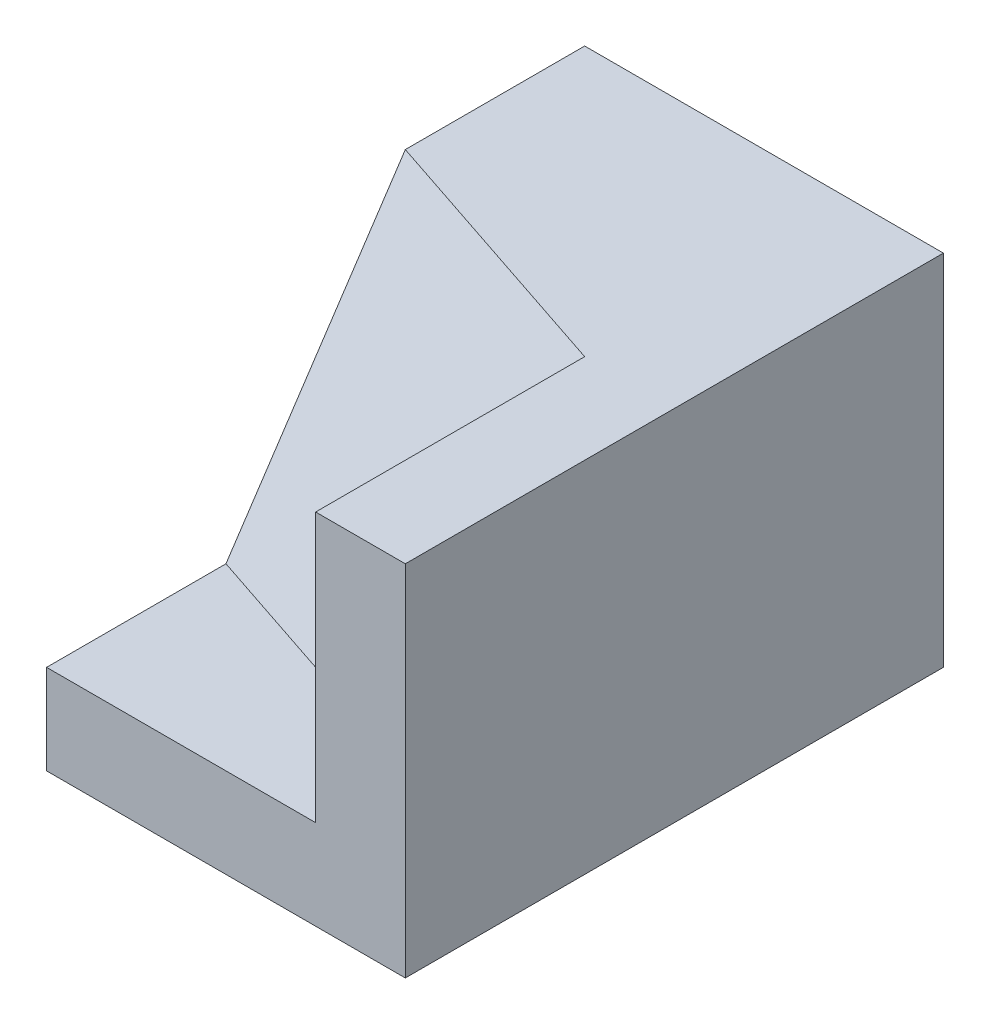
ISO-10303-21;
HEADER;
FILE_DESCRIPTION(('STEP AP214'),'2;1');
FILE_NAME('part.step','',(''),(''),'','','');
FILE_SCHEMA(('AUTOMOTIVE_DESIGN { 1 0 10303 214 1 1 1 1 }'));
ENDSEC;
DATA;
#1=APPLICATION_CONTEXT('core data for automotive mechanical design processes');
#2=APPLICATION_PROTOCOL_DEFINITION('international standard','automotive_design',2000,#1);
#3=PRODUCT_CONTEXT('',#1,'mechanical');
#4=PRODUCT('Part','Part','',(#3));
#5=PRODUCT_RELATED_PRODUCT_CATEGORY('part','',(#4));
#6=PRODUCT_DEFINITION_FORMATION('','',#4);
#7=PRODUCT_DEFINITION_CONTEXT('part definition',#1,'design');
#8=PRODUCT_DEFINITION('design','',#6,#7);
#9=PRODUCT_DEFINITION_SHAPE('','',#8);
#10=(LENGTH_UNIT() NAMED_UNIT(*) SI_UNIT(.MILLI.,.METRE.));
#11=(NAMED_UNIT(*) PLANE_ANGLE_UNIT() SI_UNIT($,.RADIAN.));
#12=(NAMED_UNIT(*) SI_UNIT($,.STERADIAN.) SOLID_ANGLE_UNIT());
#13=UNCERTAINTY_MEASURE_WITH_UNIT(LENGTH_MEASURE(1.E-05),#10,'distance_accuracy_value','');
#14=(GEOMETRIC_REPRESENTATION_CONTEXT(3) GLOBAL_UNCERTAINTY_ASSIGNED_CONTEXT((#13)) GLOBAL_UNIT_ASSIGNED_CONTEXT((#10,
#11,#12)) REPRESENTATION_CONTEXT('',''));
#15=CARTESIAN_POINT('',(0.,0.,0.));
#16=DIRECTION('',(0.,0.,1.));
#17=DIRECTION('',(1.,0.,0.));
#18=AXIS2_PLACEMENT_3D('',#15,#16,#17);
#19=CARTESIAN_POINT('',(40.,35.6438356164384,32.8767123287671));
#20=DIRECTION('',(0.,-1.,0.));
#21=DIRECTION('',(0.,0.,-1.));
#22=AXIS2_PLACEMENT_3D('',#19,#20,#21);
#23=PLANE('',#22);
#24=DIRECTION('',(-0.948683298050514,0.,-0.316227766016837));
#25=VECTOR('',#24,1.);
#26=CARTESIAN_POINT('',(31.0058479643561,35.6438356164384,3.21199498355246));
#27=LINE('',#26,#25);
#28=CARTESIAN_POINT('',(30.,35.6438356164384,2.8767123287671));
#29=VERTEX_POINT('',#28);
#30=CARTESIAN_POINT('',(0.,35.6438356164384,-7.12328767123287));
#31=VERTEX_POINT('',#30);
#32=EDGE_CURVE('E48',#29,#31,#27,.T.);
#33=ORIENTED_EDGE('',*,*,#32,.F.);
#34=DIRECTION('',(0.,0.,-1.));
#35=VECTOR('',#34,1.);
#36=CARTESIAN_POINT('',(30.,35.6438356164384,22.8767123287671));
#37=LINE('',#36,#35);
#38=CARTESIAN_POINT('',(30.,35.6438356164384,32.8767123287671));
#39=VERTEX_POINT('',#38);
#40=EDGE_CURVE('E116',#39,#29,#37,.T.);
#41=ORIENTED_EDGE('',*,*,#40,.F.);
#42=DIRECTION('',(-1.,0.,0.));
#43=VECTOR('',#42,1.);
#44=CARTESIAN_POINT('',(40.,35.6438356164384,32.8767123287671));
#45=LINE('',#44,#43);
#46=CARTESIAN_POINT('',(40.,35.6438356164384,32.8767123287671));
#47=VERTEX_POINT('',#46);
#48=EDGE_CURVE('E137',#47,#39,#45,.T.);
#49=ORIENTED_EDGE('',*,*,#48,.F.);
#50=DIRECTION('',(0.,0.,1.));
#51=VECTOR('',#50,1.);
#52=CARTESIAN_POINT('',(40.,35.6438356164384,32.8767123287671));
#53=LINE('',#52,#51);
#54=CARTESIAN_POINT('',(40.,35.6438356164384,-27.1232876712329));
#55=VERTEX_POINT('',#54);
#56=EDGE_CURVE('E57',#55,#47,#53,.T.);
#57=ORIENTED_EDGE('',*,*,#56,.F.);
#58=DIRECTION('',(-1.,0.,0.));
#59=VECTOR('',#58,1.);
#60=CARTESIAN_POINT('',(40.,35.6438356164384,-27.1232876712329));
#61=LINE('',#60,#59);
#62=CARTESIAN_POINT('',(0.,35.6438356164384,-27.1232876712329));
#63=VERTEX_POINT('',#62);
#64=EDGE_CURVE('E146',#55,#63,#61,.T.);
#65=ORIENTED_EDGE('',*,*,#64,.T.);
#66=DIRECTION('',(0.,0.,1.));
#67=VECTOR('',#66,1.);
#68=CARTESIAN_POINT('',(0.,35.6438356164384,32.8767123287671));
#69=LINE('',#68,#67);
#70=EDGE_CURVE('E132',#63,#31,#69,.T.);
#71=ORIENTED_EDGE('',*,*,#70,.T.);
#72=EDGE_LOOP('',(#33,#41,#49,#57,#65,#71));
#73=FACE_BOUND('',#72,.T.);
#74=ADVANCED_FACE('F33',(#73),#23,.F.);
#75=CARTESIAN_POINT('',(0.,0.,0.));
#76=DIRECTION('',(-1.,0.,0.));
#77=DIRECTION('',(0.,0.,1.));
#78=AXIS2_PLACEMENT_3D('',#75,#76,#77);
#79=PLANE('',#78);
#80=DIRECTION('',(0.,0.,1.));
#81=VECTOR('',#80,1.);
#82=CARTESIAN_POINT('',(0.,5.64383561643836,12.8767123287671));
#83=LINE('',#82,#81);
#84=CARTESIAN_POINT('',(0.,5.64383561643836,12.8767123287671));
#85=VERTEX_POINT('',#84);
#86=CARTESIAN_POINT('',(0.,5.64383561643836,32.8767123287671));
#87=VERTEX_POINT('',#86);
#88=EDGE_CURVE('E123',#85,#87,#83,.T.);
#89=ORIENTED_EDGE('',*,*,#88,.F.);
#90=DIRECTION('',(0.,0.832050294337844,-0.554700196225229));
#91=VECTOR('',#90,1.);
#92=CARTESIAN_POINT('',(0.,0.873705160383596,16.0567992994703));
#93=LINE('',#92,#91);
#94=EDGE_CURVE('E105',#85,#31,#93,.T.);
#95=ORIENTED_EDGE('',*,*,#94,.T.);
#96=ORIENTED_EDGE('',*,*,#70,.F.);
#97=DIRECTION('',(0.,1.,0.));
#98=VECTOR('',#97,1.);
#99=CARTESIAN_POINT('',(0.,-4.35616438356165,-27.1232876712329));
#100=LINE('',#99,#98);
#101=CARTESIAN_POINT('',(0.,-4.35616438356165,-27.1232876712329));
#102=VERTEX_POINT('',#101);
#103=EDGE_CURVE('E76',#102,#63,#100,.T.);
#104=ORIENTED_EDGE('',*,*,#103,.F.);
#105=DIRECTION('',(0.,0.,-1.));
#106=VECTOR('',#105,1.);
#107=CARTESIAN_POINT('',(0.,-4.35616438356165,32.8767123287671));
#108=LINE('',#107,#106);
#109=CARTESIAN_POINT('',(0.,-4.35616438356165,32.8767123287671));
#110=VERTEX_POINT('',#109);
#111=EDGE_CURVE('E139',#110,#102,#108,.T.);
#112=ORIENTED_EDGE('',*,*,#111,.F.);
#113=DIRECTION('',(0.,-1.,0.));
#114=VECTOR('',#113,1.);
#115=CARTESIAN_POINT('',(0.,-4.35616438356165,32.8767123287671));
#116=LINE('',#115,#114);
#117=EDGE_CURVE('E129',#87,#110,#116,.T.);
#118=ORIENTED_EDGE('',*,*,#117,.F.);
#119=EDGE_LOOP('',(#89,#95,#96,#104,#112,#118));
#120=FACE_BOUND('',#119,.T.);
#121=ADVANCED_FACE('F152',(#120),#79,.T.);
#122=CARTESIAN_POINT('',(40.,-4.35616438356165,32.8767123287671));
#123=DIRECTION('',(0.,0.,-1.));
#124=DIRECTION('',(-1.,0.,0.));
#125=AXIS2_PLACEMENT_3D('',#122,#123,#124);
#126=PLANE('',#125);
#127=ORIENTED_EDGE('',*,*,#48,.T.);
#128=DIRECTION('',(0.,1.,0.));
#129=VECTOR('',#128,1.);
#130=CARTESIAN_POINT('',(30.,5.64383561643836,32.8767123287671));
#131=LINE('',#130,#129);
#132=CARTESIAN_POINT('',(30.,5.64383561643836,32.8767123287671));
#133=VERTEX_POINT('',#132);
#134=EDGE_CURVE('E109',#133,#39,#131,.T.);
#135=ORIENTED_EDGE('',*,*,#134,.F.);
#136=DIRECTION('',(1.,0.,0.));
#137=VECTOR('',#136,1.);
#138=CARTESIAN_POINT('',(0.,5.64383561643836,32.8767123287671));
#139=LINE('',#138,#137);
#140=EDGE_CURVE('E120',#87,#133,#139,.T.);
#141=ORIENTED_EDGE('',*,*,#140,.F.);
#142=ORIENTED_EDGE('',*,*,#117,.T.);
#143=DIRECTION('',(-1.,0.,0.));
#144=VECTOR('',#143,1.);
#145=CARTESIAN_POINT('',(40.,-4.35616438356165,32.8767123287671));
#146=LINE('',#145,#144);
#147=CARTESIAN_POINT('',(40.,-4.35616438356165,32.8767123287671));
#148=VERTEX_POINT('',#147);
#149=EDGE_CURVE('E11',#148,#110,#146,.T.);
#150=ORIENTED_EDGE('',*,*,#149,.F.);
#151=DIRECTION('',(0.,-1.,0.));
#152=VECTOR('',#151,1.);
#153=CARTESIAN_POINT('',(40.,-4.35616438356165,32.8767123287671));
#154=LINE('',#153,#152);
#155=EDGE_CURVE('E130',#47,#148,#154,.T.);
#156=ORIENTED_EDGE('',*,*,#155,.F.);
#157=EDGE_LOOP('',(#127,#135,#141,#142,#150,#156));
#158=FACE_BOUND('',#157,.T.);
#159=ADVANCED_FACE('F35',(#158),#126,.F.);
#160=CARTESIAN_POINT('',(40.,-4.35616438356165,32.8767123287671));
#161=DIRECTION('',(0.,1.,0.));
#162=DIRECTION('',(0.,0.,1.));
#163=AXIS2_PLACEMENT_3D('',#160,#161,#162);
#164=PLANE('',#163);
#165=ORIENTED_EDGE('',*,*,#111,.T.);
#166=DIRECTION('',(-1.,0.,0.));
#167=VECTOR('',#166,1.);
#168=CARTESIAN_POINT('',(40.,-4.35616438356165,-27.1232876712329));
#169=LINE('',#168,#167);
#170=CARTESIAN_POINT('',(40.,-4.35616438356165,-27.1232876712329));
#171=VERTEX_POINT('',#170);
#172=EDGE_CURVE('E41',#171,#102,#169,.T.);
#173=ORIENTED_EDGE('',*,*,#172,.F.);
#174=DIRECTION('',(0.,0.,-1.));
#175=VECTOR('',#174,1.);
#176=CARTESIAN_POINT('',(40.,-4.35616438356165,32.8767123287671));
#177=LINE('',#176,#175);
#178=EDGE_CURVE('E83',#148,#171,#177,.T.);
#179=ORIENTED_EDGE('',*,*,#178,.F.);
#180=ORIENTED_EDGE('',*,*,#149,.T.);
#181=EDGE_LOOP('',(#165,#173,#179,#180));
#182=FACE_BOUND('',#181,.T.);
#183=ADVANCED_FACE('F166',(#182),#164,.F.);
#184=CARTESIAN_POINT('',(40.,-4.35616438356165,-27.1232876712329));
#185=DIRECTION('',(0.,0.,1.));
#186=DIRECTION('',(0.,-1.,0.));
#187=AXIS2_PLACEMENT_3D('',#184,#185,#186);
#188=PLANE('',#187);
#189=ORIENTED_EDGE('',*,*,#103,.T.);
#190=ORIENTED_EDGE('',*,*,#64,.F.);
#191=DIRECTION('',(0.,1.,0.));
#192=VECTOR('',#191,1.);
#193=CARTESIAN_POINT('',(40.,-4.35616438356165,-27.1232876712329));
#194=LINE('',#193,#192);
#195=EDGE_CURVE('E134',#171,#55,#194,.T.);
#196=ORIENTED_EDGE('',*,*,#195,.F.);
#197=ORIENTED_EDGE('',*,*,#172,.T.);
#198=EDGE_LOOP('',(#189,#190,#196,#197));
#199=FACE_BOUND('',#198,.T.);
#200=ADVANCED_FACE('F148',(#199),#188,.F.);
#201=CARTESIAN_POINT('',(40.,0.,0.));
#202=DIRECTION('',(-1.,0.,0.));
#203=DIRECTION('',(0.,0.,1.));
#204=AXIS2_PLACEMENT_3D('',#201,#202,#203);
#205=PLANE('',#204);
#206=ORIENTED_EDGE('',*,*,#155,.T.);
#207=ORIENTED_EDGE('',*,*,#178,.T.);
#208=ORIENTED_EDGE('',*,*,#195,.T.);
#209=ORIENTED_EDGE('',*,*,#56,.T.);
#210=EDGE_LOOP('',(#206,#207,#208,#209));
#211=FACE_BOUND('',#210,.T.);
#212=ADVANCED_FACE('F158',(#211),#205,.F.);
#213=CARTESIAN_POINT('',(30.,5.64383561643836,22.8767123287671));
#214=DIRECTION('',(1.,0.,0.));
#215=DIRECTION('',(0.,0.,-1.));
#216=AXIS2_PLACEMENT_3D('',#213,#214,#215);
#217=PLANE('',#216);
#218=ORIENTED_EDGE('',*,*,#40,.T.);
#219=DIRECTION('',(0.,-0.832050294337844,0.554700196225229));
#220=VECTOR('',#219,1.);
#221=CARTESIAN_POINT('',(30.,5.4890897757682,22.9798762225472));
#222=LINE('',#221,#220);
#223=CARTESIAN_POINT('',(30.,5.64383561643836,22.8767123287671));
#224=VERTEX_POINT('',#223);
#225=EDGE_CURVE('E104',#29,#224,#222,.T.);
#226=ORIENTED_EDGE('',*,*,#225,.T.);
#227=DIRECTION('',(0.,0.,-1.));
#228=VECTOR('',#227,1.);
#229=CARTESIAN_POINT('',(30.,5.64383561643836,22.8767123287671));
#230=LINE('',#229,#228);
#231=EDGE_CURVE('E110',#133,#224,#230,.T.);
#232=ORIENTED_EDGE('',*,*,#231,.F.);
#233=ORIENTED_EDGE('',*,*,#134,.T.);
#234=EDGE_LOOP('',(#218,#226,#232,#233));
#235=FACE_BOUND('',#234,.T.);
#236=ADVANCED_FACE('F113',(#235),#217,.F.);
#237=CARTESIAN_POINT('',(0.,5.64383561643836,0.));
#238=DIRECTION('',(0.,1.,0.));
#239=DIRECTION('',(0.,0.,1.));
#240=AXIS2_PLACEMENT_3D('',#237,#238,#239);
#241=PLANE('',#240);
#242=ORIENTED_EDGE('',*,*,#88,.T.);
#243=ORIENTED_EDGE('',*,*,#140,.T.);
#244=ORIENTED_EDGE('',*,*,#231,.T.);
#245=DIRECTION('',(-0.948683298050514,0.,-0.316227766016838));
#246=VECTOR('',#245,1.);
#247=CARTESIAN_POINT('',(0.,5.64383561643836,12.8767123287671));
#248=LINE('',#247,#246);
#249=EDGE_CURVE('E101',#224,#85,#248,.T.);
#250=ORIENTED_EDGE('',*,*,#249,.T.);
#251=EDGE_LOOP('',(#242,#243,#244,#250));
#252=FACE_BOUND('',#251,.T.);
#253=ADVANCED_FACE('F118',(#252),#241,.T.);
#254=CARTESIAN_POINT('',(31.0058479643561,5.64383561643836,23.2119949835525));
#255=DIRECTION('',(0.267261241912424,-0.534522483824849,-0.801783725737273));
#256=DIRECTION('',(0.,0.832050294337844,-0.554700196225229));
#257=AXIS2_PLACEMENT_3D('',#254,#255,#256);
#258=PLANE('',#257);
#259=ORIENTED_EDGE('',*,*,#249,.F.);
#260=ORIENTED_EDGE('',*,*,#225,.F.);
#261=ORIENTED_EDGE('',*,*,#32,.T.);
#262=ORIENTED_EDGE('',*,*,#94,.F.);
#263=EDGE_LOOP('',(#259,#260,#261,#262));
#264=FACE_BOUND('',#263,.T.);
#265=ADVANCED_FACE('F103',(#264),#258,.F.);
#266=CLOSED_SHELL('',(#74,#121,#159,#183,#200,#212,#236,#253,#265));
#267=MANIFOLD_SOLID_BREP('B2',#266);
#268=ADVANCED_BREP_SHAPE_REPRESENTATION('',(#18,#267),#14);
#269=SHAPE_DEFINITION_REPRESENTATION(#9,#268);
ENDSEC;
END-ISO-10303-21;
